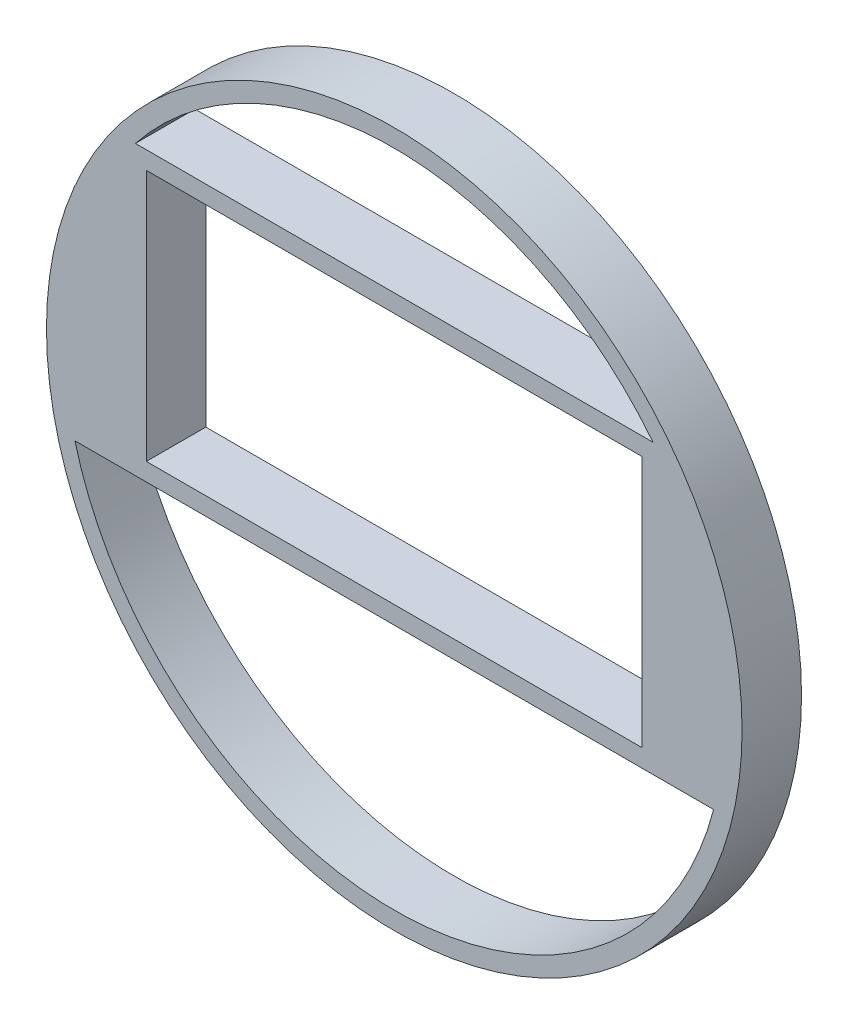
ISO-10303-21;
HEADER;
FILE_DESCRIPTION(('STEP AP214'),'2;1');
FILE_NAME('part.step','',(''),(''),'','','');
FILE_SCHEMA(('AUTOMOTIVE_DESIGN { 1 0 10303 214 1 1 1 1 }'));
ENDSEC;
DATA;
#1=APPLICATION_CONTEXT('core data for automotive mechanical design processes');
#2=APPLICATION_PROTOCOL_DEFINITION('international standard','automotive_design',2000,#1);
#3=PRODUCT_CONTEXT('',#1,'mechanical');
#4=PRODUCT('Part','Part','',(#3));
#5=PRODUCT_RELATED_PRODUCT_CATEGORY('part','',(#4));
#6=PRODUCT_DEFINITION_FORMATION('','',#4);
#7=PRODUCT_DEFINITION_CONTEXT('part definition',#1,'design');
#8=PRODUCT_DEFINITION('design','',#6,#7);
#9=PRODUCT_DEFINITION_SHAPE('','',#8);
#10=(LENGTH_UNIT() NAMED_UNIT(*) SI_UNIT(.MILLI.,.METRE.));
#11=(NAMED_UNIT(*) PLANE_ANGLE_UNIT() SI_UNIT($,.RADIAN.));
#12=(NAMED_UNIT(*) SI_UNIT($,.STERADIAN.) SOLID_ANGLE_UNIT());
#13=UNCERTAINTY_MEASURE_WITH_UNIT(LENGTH_MEASURE(1.E-05),#10,'distance_accuracy_value','');
#14=(GEOMETRIC_REPRESENTATION_CONTEXT(3) GLOBAL_UNCERTAINTY_ASSIGNED_CONTEXT((#13)) GLOBAL_UNIT_ASSIGNED_CONTEXT((#10,
#11,#12)) REPRESENTATION_CONTEXT('',''));
#15=CARTESIAN_POINT('',(0.,0.,0.));
#16=DIRECTION('',(0.,0.,1.));
#17=DIRECTION('',(1.,0.,0.));
#18=AXIS2_PLACEMENT_3D('',#15,#16,#17);
#19=CARTESIAN_POINT('',(0.,0.,0.001));
#20=DIRECTION('',(0.,0.,1.));
#21=DIRECTION('',(1.,0.,0.));
#22=AXIS2_PLACEMENT_3D('',#19,#20,#21);
#23=PLANE('',#22);
#24=CARTESIAN_POINT('',(0.,0.,0.000999999999999265));
#25=DIRECTION('',(0.,0.,-1.));
#26=DIRECTION('',(-1.,0.,0.));
#27=AXIS2_PLACEMENT_3D('',#24,#25,#26);
#28=CIRCLE('',#27,55.5);
#29=CARTESIAN_POINT('',(53.7095568330712,-13.9833295318065,0.001));
#30=VERTEX_POINT('',#29);
#31=CARTESIAN_POINT('',(-53.7095568330712,-13.9833295318065,0.000999999999999265));
#32=VERTEX_POINT('',#31);
#33=EDGE_CURVE('E54',#30,#32,#28,.T.);
#34=ORIENTED_EDGE('',*,*,#33,.T.);
#35=DIRECTION('',(1.,0.,0.));
#36=VECTOR('',#35,1.);
#37=CARTESIAN_POINT('',(0.,-13.9833295318065,0.000999999999999265));
#38=LINE('',#37,#36);
#39=EDGE_CURVE('E127',#32,#30,#38,.T.);
#40=ORIENTED_EDGE('',*,*,#39,.T.);
#41=EDGE_LOOP('',(#34,#40));
#42=FACE_BOUND('',#41,.T.);
#43=DIRECTION('',(-1.,0.,0.));
#44=VECTOR('',#43,1.);
#45=CARTESIAN_POINT('',(0.,34.4166704681935,0.000999999999999265));
#46=LINE('',#45,#44);
#47=CARTESIAN_POINT('',(43.5401285469368,34.4166704681935,0.001));
#48=VERTEX_POINT('',#47);
#49=CARTESIAN_POINT('',(-43.5401285469368,34.4166704681935,0.000999999999999265));
#50=VERTEX_POINT('',#49);
#51=EDGE_CURVE('E62',#48,#50,#46,.T.);
#52=ORIENTED_EDGE('',*,*,#51,.T.);
#53=CARTESIAN_POINT('',(0.,0.,0.000999999999999265));
#54=DIRECTION('',(0.,0.,-1.));
#55=DIRECTION('',(-1.,0.,0.));
#56=AXIS2_PLACEMENT_3D('',#53,#54,#55);
#57=CIRCLE('',#56,55.5);
#58=EDGE_CURVE('E111',#50,#48,#57,.T.);
#59=ORIENTED_EDGE('',*,*,#58,.T.);
#60=EDGE_LOOP('',(#52,#59));
#61=FACE_BOUND('',#60,.T.);
#62=CARTESIAN_POINT('',(0.,0.,0.001));
#63=DIRECTION('',(0.,0.,1.));
#64=DIRECTION('',(1.,0.,0.));
#65=AXIS2_PLACEMENT_3D('',#62,#63,#64);
#66=CIRCLE('',#65,58.5);
#67=CARTESIAN_POINT('',(58.5,0.,0.001));
#68=VERTEX_POINT('',#67);
#69=EDGE_CURVE('E11',#68,#68,#66,.T.);
#70=ORIENTED_EDGE('',*,*,#69,.T.);
#71=EDGE_LOOP('',(#70));
#72=FACE_BOUND('',#71,.T.);
#73=DIRECTION('',(-1.,0.,0.));
#74=VECTOR('',#73,1.);
#75=CARTESIAN_POINT('',(0.,-10.9833295318065,0.000999999999999265));
#76=LINE('',#75,#74);
#77=CARTESIAN_POINT('',(41.7,-10.9833295318065,0.000999999999999265));
#78=VERTEX_POINT('',#77);
#79=CARTESIAN_POINT('',(-41.7,-10.9833295318065,0.000999999999999265));
#80=VERTEX_POINT('',#79);
#81=EDGE_CURVE('E147',#78,#80,#76,.T.);
#82=ORIENTED_EDGE('',*,*,#81,.T.);
#83=DIRECTION('',(0.,-1.,0.));
#84=VECTOR('',#83,1.);
#85=CARTESIAN_POINT('',(-41.7,0.,0.000999999999999265));
#86=LINE('',#85,#84);
#87=CARTESIAN_POINT('',(-41.7,31.4166704681935,0.000999999999999265));
#88=VERTEX_POINT('',#87);
#89=EDGE_CURVE('E139',#88,#80,#86,.T.);
#90=ORIENTED_EDGE('',*,*,#89,.F.);
#91=DIRECTION('',(-1.,0.,0.));
#92=VECTOR('',#91,1.);
#93=CARTESIAN_POINT('',(0.,31.4166704681935,0.000999999999999265));
#94=LINE('',#93,#92);
#95=CARTESIAN_POINT('',(41.7,31.4166704681935,0.001));
#96=VERTEX_POINT('',#95);
#97=EDGE_CURVE('E141',#96,#88,#94,.T.);
#98=ORIENTED_EDGE('',*,*,#97,.F.);
#99=DIRECTION('',(0.,-1.,0.));
#100=VECTOR('',#99,1.);
#101=CARTESIAN_POINT('',(41.7,0.,0.000999999999999265));
#102=LINE('',#101,#100);
#103=EDGE_CURVE('E144',#96,#78,#102,.T.);
#104=ORIENTED_EDGE('',*,*,#103,.T.);
#105=EDGE_LOOP('',(#82,#90,#98,#104));
#106=FACE_BOUND('',#105,.T.);
#107=ADVANCED_FACE('F39',(#42,#61,#72,#106),#23,.T.);
#108=CARTESIAN_POINT('',(0.,0.,-10.));
#109=DIRECTION('',(0.,0.,-1.));
#110=DIRECTION('',(-1.,0.,0.));
#111=AXIS2_PLACEMENT_3D('',#108,#109,#110);
#112=PLANE('',#111);
#113=CARTESIAN_POINT('',(0.,0.,-10.));
#114=DIRECTION('',(0.,0.,-1.));
#115=DIRECTION('',(-1.,0.,0.));
#116=AXIS2_PLACEMENT_3D('',#113,#114,#115);
#117=CIRCLE('',#116,55.5);
#118=CARTESIAN_POINT('',(53.7095568330712,-13.9833295318065,-10.));
#119=VERTEX_POINT('',#118);
#120=CARTESIAN_POINT('',(-53.7095568330712,-13.9833295318065,-10.));
#121=VERTEX_POINT('',#120);
#122=EDGE_CURVE('E132',#119,#121,#117,.T.);
#123=ORIENTED_EDGE('',*,*,#122,.F.);
#124=DIRECTION('',(1.,0.,0.));
#125=VECTOR('',#124,1.);
#126=CARTESIAN_POINT('',(0.,-13.9833295318065,-10.));
#127=LINE('',#126,#125);
#128=EDGE_CURVE('E128',#121,#119,#127,.T.);
#129=ORIENTED_EDGE('',*,*,#128,.F.);
#130=EDGE_LOOP('',(#123,#129));
#131=FACE_BOUND('',#130,.T.);
#132=DIRECTION('',(-1.,0.,0.));
#133=VECTOR('',#132,1.);
#134=CARTESIAN_POINT('',(0.,34.4166704681935,-10.));
#135=LINE('',#134,#133);
#136=CARTESIAN_POINT('',(43.5401285469368,34.4166704681935,-10.));
#137=VERTEX_POINT('',#136);
#138=CARTESIAN_POINT('',(-43.5401285469368,34.4166704681935,-10.));
#139=VERTEX_POINT('',#138);
#140=EDGE_CURVE('E106',#137,#139,#135,.T.);
#141=ORIENTED_EDGE('',*,*,#140,.F.);
#142=CARTESIAN_POINT('',(0.,0.,-10.));
#143=DIRECTION('',(0.,0.,-1.));
#144=DIRECTION('',(-1.,0.,0.));
#145=AXIS2_PLACEMENT_3D('',#142,#143,#144);
#146=CIRCLE('',#145,55.5);
#147=EDGE_CURVE('E118',#139,#137,#146,.T.);
#148=ORIENTED_EDGE('',*,*,#147,.F.);
#149=EDGE_LOOP('',(#141,#148));
#150=FACE_BOUND('',#149,.T.);
#151=CARTESIAN_POINT('',(0.,0.,-10.));
#152=DIRECTION('',(0.,0.,-1.));
#153=DIRECTION('',(-1.,0.,0.));
#154=AXIS2_PLACEMENT_3D('',#151,#152,#153);
#155=CIRCLE('',#154,58.5);
#156=CARTESIAN_POINT('',(-58.5,0.,-10.));
#157=VERTEX_POINT('',#156);
#158=EDGE_CURVE('E47',#157,#157,#155,.T.);
#159=ORIENTED_EDGE('',*,*,#158,.T.);
#160=EDGE_LOOP('',(#159));
#161=FACE_BOUND('',#160,.T.);
#162=DIRECTION('',(-1.,0.,0.));
#163=VECTOR('',#162,1.);
#164=CARTESIAN_POINT('',(0.,31.4166704681935,-10.));
#165=LINE('',#164,#163);
#166=CARTESIAN_POINT('',(41.7,31.4166704681935,-10.));
#167=VERTEX_POINT('',#166);
#168=CARTESIAN_POINT('',(-41.7,31.4166704681935,-10.));
#169=VERTEX_POINT('',#168);
#170=EDGE_CURVE('E153',#167,#169,#165,.T.);
#171=ORIENTED_EDGE('',*,*,#170,.T.);
#172=DIRECTION('',(0.,-1.,0.));
#173=VECTOR('',#172,1.);
#174=CARTESIAN_POINT('',(-41.7,0.,-10.));
#175=LINE('',#174,#173);
#176=CARTESIAN_POINT('',(-41.7,-10.9833295318065,-10.));
#177=VERTEX_POINT('',#176);
#178=EDGE_CURVE('E124',#169,#177,#175,.T.);
#179=ORIENTED_EDGE('',*,*,#178,.T.);
#180=DIRECTION('',(-1.,0.,0.));
#181=VECTOR('',#180,1.);
#182=CARTESIAN_POINT('',(0.,-10.9833295318065,-10.));
#183=LINE('',#182,#181);
#184=CARTESIAN_POINT('',(41.7,-10.9833295318065,-10.));
#185=VERTEX_POINT('',#184);
#186=EDGE_CURVE('E142',#185,#177,#183,.T.);
#187=ORIENTED_EDGE('',*,*,#186,.F.);
#188=DIRECTION('',(0.,-1.,0.));
#189=VECTOR('',#188,1.);
#190=CARTESIAN_POINT('',(41.7,0.,-10.));
#191=LINE('',#190,#189);
#192=EDGE_CURVE('E156',#167,#185,#191,.T.);
#193=ORIENTED_EDGE('',*,*,#192,.F.);
#194=EDGE_LOOP('',(#171,#179,#187,#193));
#195=FACE_BOUND('',#194,.T.);
#196=ADVANCED_FACE('F171',(#131,#150,#161,#195),#112,.T.);
#197=CARTESIAN_POINT('',(0.,0.,0.001));
#198=DIRECTION('',(0.,0.,-1.));
#199=DIRECTION('',(-1.,0.,0.));
#200=AXIS2_PLACEMENT_3D('',#197,#198,#199);
#201=CYLINDRICAL_SURFACE('',#200,58.5);
#202=ORIENTED_EDGE('',*,*,#69,.F.);
#203=EDGE_LOOP('',(#202));
#204=FACE_BOUND('',#203,.T.);
#205=ORIENTED_EDGE('',*,*,#158,.F.);
#206=EDGE_LOOP('',(#205));
#207=FACE_BOUND('',#206,.T.);
#208=ADVANCED_FACE('F41',(#204,#207),#201,.T.);
#209=CARTESIAN_POINT('',(-41.7,0.,0.000999999999999265));
#210=DIRECTION('',(1.,0.,0.));
#211=DIRECTION('',(0.,1.,0.));
#212=AXIS2_PLACEMENT_3D('',#209,#210,#211);
#213=PLANE('',#212);
#214=ORIENTED_EDGE('',*,*,#178,.F.);
#215=DIRECTION('',(0.,0.,-1.));
#216=VECTOR('',#215,1.);
#217=CARTESIAN_POINT('',(-41.7,31.4166704681935,0.000999999999999265));
#218=LINE('',#217,#216);
#219=EDGE_CURVE('E150',#88,#169,#218,.T.);
#220=ORIENTED_EDGE('',*,*,#219,.F.);
#221=ORIENTED_EDGE('',*,*,#89,.T.);
#222=DIRECTION('',(0.,0.,-1.));
#223=VECTOR('',#222,1.);
#224=CARTESIAN_POINT('',(-41.7,-10.9833295318065,0.000999999999999265));
#225=LINE('',#224,#223);
#226=EDGE_CURVE('E161',#80,#177,#225,.T.);
#227=ORIENTED_EDGE('',*,*,#226,.T.);
#228=EDGE_LOOP('',(#214,#220,#221,#227));
#229=FACE_BOUND('',#228,.T.);
#230=ADVANCED_FACE('F175',(#229),#213,.T.);
#231=CARTESIAN_POINT('',(0.,-10.9833295318065,0.000999999999999265));
#232=DIRECTION('',(0.,-1.,0.));
#233=DIRECTION('',(0.,0.,-1.));
#234=AXIS2_PLACEMENT_3D('',#231,#232,#233);
#235=PLANE('',#234);
#236=ORIENTED_EDGE('',*,*,#186,.T.);
#237=ORIENTED_EDGE('',*,*,#226,.F.);
#238=ORIENTED_EDGE('',*,*,#81,.F.);
#239=DIRECTION('',(0.,0.,-1.));
#240=VECTOR('',#239,1.);
#241=CARTESIAN_POINT('',(41.7,-10.9833295318065,0.000999999999999265));
#242=LINE('',#241,#240);
#243=EDGE_CURVE('E163',#78,#185,#242,.T.);
#244=ORIENTED_EDGE('',*,*,#243,.T.);
#245=EDGE_LOOP('',(#236,#237,#238,#244));
#246=FACE_BOUND('',#245,.T.);
#247=ADVANCED_FACE('F181',(#246),#235,.F.);
#248=CARTESIAN_POINT('',(41.7,0.,0.000999999999999265));
#249=DIRECTION('',(1.,0.,0.));
#250=DIRECTION('',(0.,1.,0.));
#251=AXIS2_PLACEMENT_3D('',#248,#249,#250);
#252=PLANE('',#251);
#253=ORIENTED_EDGE('',*,*,#192,.T.);
#254=ORIENTED_EDGE('',*,*,#243,.F.);
#255=ORIENTED_EDGE('',*,*,#103,.F.);
#256=DIRECTION('',(0.,0.,-1.));
#257=VECTOR('',#256,1.);
#258=CARTESIAN_POINT('',(41.7,31.4166704681935,0.000999999999999265));
#259=LINE('',#258,#257);
#260=EDGE_CURVE('E165',#96,#167,#259,.T.);
#261=ORIENTED_EDGE('',*,*,#260,.T.);
#262=EDGE_LOOP('',(#253,#254,#255,#261));
#263=FACE_BOUND('',#262,.T.);
#264=ADVANCED_FACE('F195',(#263),#252,.F.);
#265=CARTESIAN_POINT('',(0.,31.4166704681935,0.000999999999999265));
#266=DIRECTION('',(0.,-1.,0.));
#267=DIRECTION('',(0.,0.,-1.));
#268=AXIS2_PLACEMENT_3D('',#265,#266,#267);
#269=PLANE('',#268);
#270=ORIENTED_EDGE('',*,*,#170,.F.);
#271=ORIENTED_EDGE('',*,*,#260,.F.);
#272=ORIENTED_EDGE('',*,*,#97,.T.);
#273=ORIENTED_EDGE('',*,*,#219,.T.);
#274=EDGE_LOOP('',(#270,#271,#272,#273));
#275=FACE_BOUND('',#274,.T.);
#276=ADVANCED_FACE('F192',(#275),#269,.T.);
#277=CARTESIAN_POINT('',(0.,34.4166704681935,0.000999999999999265));
#278=DIRECTION('',(0.,-1.,0.));
#279=DIRECTION('',(0.,0.,-1.));
#280=AXIS2_PLACEMENT_3D('',#277,#278,#279);
#281=PLANE('',#280);
#282=ORIENTED_EDGE('',*,*,#140,.T.);
#283=DIRECTION('',(0.,0.,-1.));
#284=VECTOR('',#283,1.);
#285=CARTESIAN_POINT('',(-43.5401285469368,34.4166704681935,0.000999999999999265));
#286=LINE('',#285,#284);
#287=EDGE_CURVE('E102',#50,#139,#286,.T.);
#288=ORIENTED_EDGE('',*,*,#287,.F.);
#289=ORIENTED_EDGE('',*,*,#51,.F.);
#290=DIRECTION('',(0.,0.,-1.));
#291=VECTOR('',#290,1.);
#292=CARTESIAN_POINT('',(43.5401285469368,34.4166704681935,0.000999999999999265));
#293=LINE('',#292,#291);
#294=EDGE_CURVE('E110',#48,#137,#293,.T.);
#295=ORIENTED_EDGE('',*,*,#294,.T.);
#296=EDGE_LOOP('',(#282,#288,#289,#295));
#297=FACE_BOUND('',#296,.T.);
#298=ADVANCED_FACE('F104',(#297),#281,.F.);
#299=CARTESIAN_POINT('',(0.,0.,0.000999999999999265));
#300=DIRECTION('',(0.,0.,-1.));
#301=DIRECTION('',(-1.,0.,0.));
#302=AXIS2_PLACEMENT_3D('',#299,#300,#301);
#303=CYLINDRICAL_SURFACE('',#302,55.5);
#304=ORIENTED_EDGE('',*,*,#147,.T.);
#305=ORIENTED_EDGE('',*,*,#294,.F.);
#306=ORIENTED_EDGE('',*,*,#58,.F.);
#307=ORIENTED_EDGE('',*,*,#287,.T.);
#308=EDGE_LOOP('',(#304,#305,#306,#307));
#309=FACE_BOUND('',#308,.T.);
#310=ADVANCED_FACE('F114',(#309),#303,.F.);
#311=CARTESIAN_POINT('',(0.,0.,0.000999999999999265));
#312=DIRECTION('',(0.,0.,-1.));
#313=DIRECTION('',(-1.,0.,0.));
#314=AXIS2_PLACEMENT_3D('',#311,#312,#313);
#315=CYLINDRICAL_SURFACE('',#314,55.5);
#316=ORIENTED_EDGE('',*,*,#122,.T.);
#317=DIRECTION('',(0.,0.,-1.));
#318=VECTOR('',#317,1.);
#319=CARTESIAN_POINT('',(-53.7095568330712,-13.9833295318065,0.000999999999999265));
#320=LINE('',#319,#318);
#321=EDGE_CURVE('E131',#32,#121,#320,.T.);
#322=ORIENTED_EDGE('',*,*,#321,.F.);
#323=ORIENTED_EDGE('',*,*,#33,.F.);
#324=DIRECTION('',(0.,0.,-1.));
#325=VECTOR('',#324,1.);
#326=CARTESIAN_POINT('',(53.7095568330712,-13.9833295318065,0.000999999999999265));
#327=LINE('',#326,#325);
#328=EDGE_CURVE('E122',#30,#119,#327,.T.);
#329=ORIENTED_EDGE('',*,*,#328,.T.);
#330=EDGE_LOOP('',(#316,#322,#323,#329));
#331=FACE_BOUND('',#330,.T.);
#332=ADVANCED_FACE('F203',(#331),#315,.F.);
#333=CARTESIAN_POINT('',(0.,-13.9833295318065,0.000999999999999265));
#334=DIRECTION('',(0.,1.,0.));
#335=DIRECTION('',(-1.,0.,0.));
#336=AXIS2_PLACEMENT_3D('',#333,#334,#335);
#337=PLANE('',#336);
#338=ORIENTED_EDGE('',*,*,#128,.T.);
#339=ORIENTED_EDGE('',*,*,#328,.F.);
#340=ORIENTED_EDGE('',*,*,#39,.F.);
#341=ORIENTED_EDGE('',*,*,#321,.T.);
#342=EDGE_LOOP('',(#338,#339,#340,#341));
#343=FACE_BOUND('',#342,.T.);
#344=ADVANCED_FACE('F206',(#343),#337,.F.);
#345=CLOSED_SHELL('',(#107,#196,#208,#230,#247,#264,#276,#298,#310,#332,#344));
#346=MANIFOLD_SOLID_BREP('B2',#345);
#347=ADVANCED_BREP_SHAPE_REPRESENTATION('',(#18,#346),#14);
#348=SHAPE_DEFINITION_REPRESENTATION(#9,#347);
ENDSEC;
END-ISO-10303-21;
